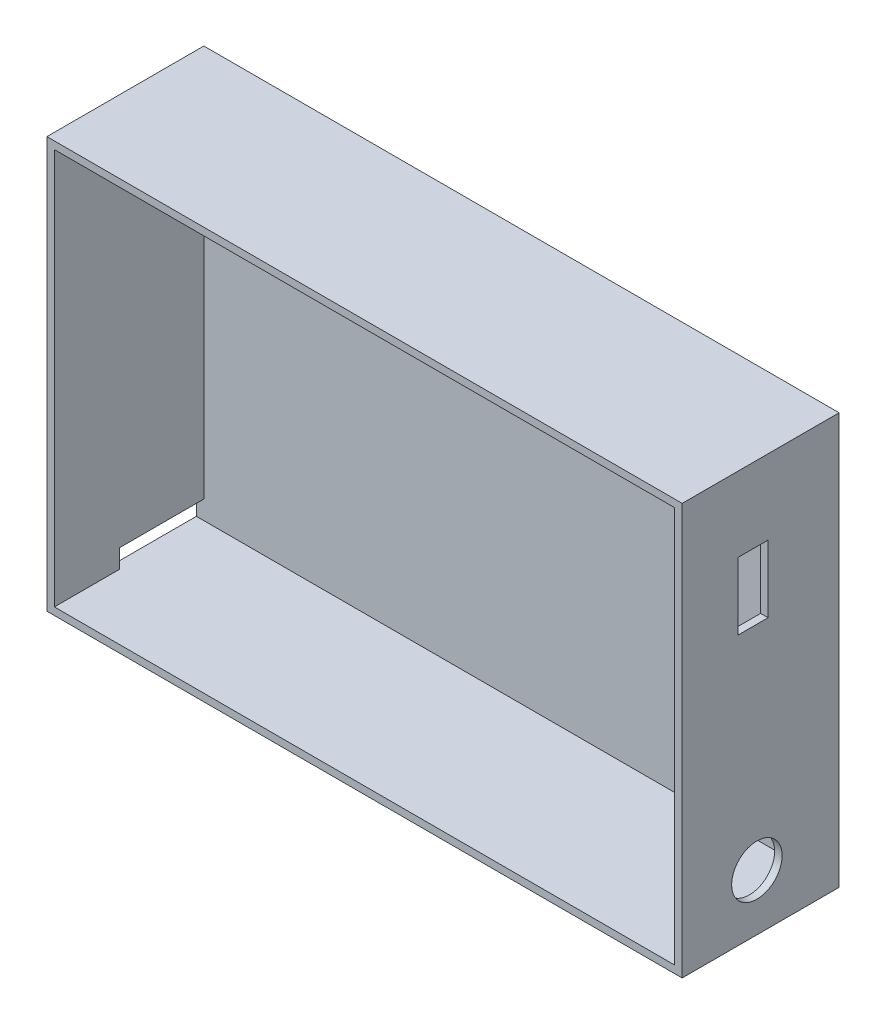
ISO-10303-21;
HEADER;
FILE_DESCRIPTION(('STEP AP214'),'2;1');
FILE_NAME('part.step','',(''),(''),'','','');
FILE_SCHEMA(('AUTOMOTIVE_DESIGN { 1 0 10303 214 1 1 1 1 }'));
ENDSEC;
DATA;
#1=APPLICATION_CONTEXT('core data for automotive mechanical design processes');
#2=APPLICATION_PROTOCOL_DEFINITION('international standard','automotive_design',2000,#1);
#3=PRODUCT_CONTEXT('',#1,'mechanical');
#4=PRODUCT('Part','Part','',(#3));
#5=PRODUCT_RELATED_PRODUCT_CATEGORY('part','',(#4));
#6=PRODUCT_DEFINITION_FORMATION('','',#4);
#7=PRODUCT_DEFINITION_CONTEXT('part definition',#1,'design');
#8=PRODUCT_DEFINITION('design','',#6,#7);
#9=PRODUCT_DEFINITION_SHAPE('','',#8);
#10=(LENGTH_UNIT() NAMED_UNIT(*) SI_UNIT(.MILLI.,.METRE.));
#11=(NAMED_UNIT(*) PLANE_ANGLE_UNIT() SI_UNIT($,.RADIAN.));
#12=(NAMED_UNIT(*) SI_UNIT($,.STERADIAN.) SOLID_ANGLE_UNIT());
#13=UNCERTAINTY_MEASURE_WITH_UNIT(LENGTH_MEASURE(1.E-05),#10,'distance_accuracy_value','');
#14=(GEOMETRIC_REPRESENTATION_CONTEXT(3) GLOBAL_UNCERTAINTY_ASSIGNED_CONTEXT((#13)) GLOBAL_UNIT_ASSIGNED_CONTEXT((#10,
#11,#12)) REPRESENTATION_CONTEXT('',''));
#15=CARTESIAN_POINT('',(0.,0.,0.));
#16=DIRECTION('',(0.,0.,1.));
#17=DIRECTION('',(1.,0.,0.));
#18=AXIS2_PLACEMENT_3D('',#15,#16,#17);
#19=CARTESIAN_POINT('',(85.,55.,2.));
#20=DIRECTION('',(-1.,0.,0.));
#21=DIRECTION('',(0.,-1.,0.));
#22=AXIS2_PLACEMENT_3D('',#19,#20,#21);
#23=PLANE('',#22);
#24=DIRECTION('',(0.,0.,1.));
#25=VECTOR('',#24,1.);
#26=CARTESIAN_POINT('',(85.,35.,27.));
#27=LINE('',#26,#25);
#28=CARTESIAN_POINT('',(85.,35.,19.));
#29=VERTEX_POINT('',#28);
#30=CARTESIAN_POINT('',(85.,35.,27.));
#31=VERTEX_POINT('',#30);
#32=EDGE_CURVE('E310',#29,#31,#27,.T.);
#33=ORIENTED_EDGE('',*,*,#32,.F.);
#34=DIRECTION('',(0.,1.,0.));
#35=VECTOR('',#34,1.);
#36=CARTESIAN_POINT('',(85.,35.,19.));
#37=LINE('',#36,#35);
#38=CARTESIAN_POINT('',(85.,17.,19.));
#39=VERTEX_POINT('',#38);
#40=EDGE_CURVE('E58',#39,#29,#37,.T.);
#41=ORIENTED_EDGE('',*,*,#40,.F.);
#42=DIRECTION('',(0.,0.,-1.));
#43=VECTOR('',#42,1.);
#44=CARTESIAN_POINT('',(85.,17.,27.));
#45=LINE('',#44,#43);
#46=CARTESIAN_POINT('',(85.,17.,27.));
#47=VERTEX_POINT('',#46);
#48=EDGE_CURVE('E299',#47,#39,#45,.T.);
#49=ORIENTED_EDGE('',*,*,#48,.F.);
#50=DIRECTION('',(0.,-1.,0.));
#51=VECTOR('',#50,1.);
#52=CARTESIAN_POINT('',(85.,35.,27.));
#53=LINE('',#52,#51);
#54=EDGE_CURVE('E314',#31,#47,#53,.T.);
#55=ORIENTED_EDGE('',*,*,#54,.F.);
#56=EDGE_LOOP('',(#33,#41,#49,#55));
#57=FACE_BOUND('',#56,.T.);
#58=CARTESIAN_POINT('',(85.,-39.9912273951,22.));
#59=DIRECTION('',(1.,0.,0.));
#60=DIRECTION('',(0.,1.,0.));
#61=AXIS2_PLACEMENT_3D('',#58,#59,#60);
#62=CIRCLE('',#61,6.75);
#63=CARTESIAN_POINT('',(85.,-33.2412273951,22.));
#64=VERTEX_POINT('',#63);
#65=EDGE_CURVE('E311',#64,#64,#62,.T.);
#66=ORIENTED_EDGE('',*,*,#65,.F.);
#67=EDGE_LOOP('',(#66));
#68=FACE_BOUND('',#67,.T.);
#69=DIRECTION('',(0.,1.,0.));
#70=VECTOR('',#69,1.);
#71=CARTESIAN_POINT('',(85.,55.,0.));
#72=LINE('',#71,#70);
#73=CARTESIAN_POINT('',(85.,-55.,0.));
#74=VERTEX_POINT('',#73);
#75=CARTESIAN_POINT('',(85.,55.,0.));
#76=VERTEX_POINT('',#75);
#77=EDGE_CURVE('E189',#74,#76,#72,.T.);
#78=ORIENTED_EDGE('',*,*,#77,.T.);
#79=DIRECTION('',(0.,0.,-1.));
#80=VECTOR('',#79,1.);
#81=CARTESIAN_POINT('',(85.,55.,2.));
#82=LINE('',#81,#80);
#83=CARTESIAN_POINT('',(85.,55.,42.));
#84=VERTEX_POINT('',#83);
#85=EDGE_CURVE('E11',#84,#76,#82,.T.);
#86=ORIENTED_EDGE('',*,*,#85,.F.);
#87=DIRECTION('',(0.,1.,0.));
#88=VECTOR('',#87,1.);
#89=CARTESIAN_POINT('',(85.,55.,42.));
#90=LINE('',#89,#88);
#91=CARTESIAN_POINT('',(85.,-55.,42.));
#92=VERTEX_POINT('',#91);
#93=EDGE_CURVE('E183',#92,#84,#90,.T.);
#94=ORIENTED_EDGE('',*,*,#93,.F.);
#95=DIRECTION('',(0.,0.,-1.));
#96=VECTOR('',#95,1.);
#97=CARTESIAN_POINT('',(85.,-55.,2.));
#98=LINE('',#97,#96);
#99=EDGE_CURVE('E198',#92,#74,#98,.T.);
#100=ORIENTED_EDGE('',*,*,#99,.T.);
#101=EDGE_LOOP('',(#78,#86,#94,#100));
#102=FACE_BOUND('',#101,.T.);
#103=ADVANCED_FACE('F36',(#57,#68,#102),#23,.F.);
#104=CARTESIAN_POINT('',(-85.,55.,2.));
#105=DIRECTION('',(0.,-1.,0.));
#106=DIRECTION('',(0.,0.,-1.));
#107=AXIS2_PLACEMENT_3D('',#104,#105,#106);
#108=PLANE('',#107);
#109=DIRECTION('',(-1.,0.,0.));
#110=VECTOR('',#109,1.);
#111=CARTESIAN_POINT('',(-85.,55.,0.));
#112=LINE('',#111,#110);
#113=CARTESIAN_POINT('',(-85.,55.,0.));
#114=VERTEX_POINT('',#113);
#115=EDGE_CURVE('E192',#76,#114,#112,.T.);
#116=ORIENTED_EDGE('',*,*,#115,.T.);
#117=DIRECTION('',(0.,0.,-1.));
#118=VECTOR('',#117,1.);
#119=CARTESIAN_POINT('',(-85.,55.,2.));
#120=LINE('',#119,#118);
#121=CARTESIAN_POINT('',(-85.,55.,42.));
#122=VERTEX_POINT('',#121);
#123=EDGE_CURVE('E43',#122,#114,#120,.T.);
#124=ORIENTED_EDGE('',*,*,#123,.F.);
#125=DIRECTION('',(-1.,0.,0.));
#126=VECTOR('',#125,1.);
#127=CARTESIAN_POINT('',(-85.,55.,42.));
#128=LINE('',#127,#126);
#129=EDGE_CURVE('E186',#84,#122,#128,.T.);
#130=ORIENTED_EDGE('',*,*,#129,.F.);
#131=ORIENTED_EDGE('',*,*,#85,.T.);
#132=EDGE_LOOP('',(#116,#124,#130,#131));
#133=FACE_BOUND('',#132,.T.);
#134=ADVANCED_FACE('F222',(#133),#108,.F.);
#135=CARTESIAN_POINT('',(-85.,55.,2.));
#136=DIRECTION('',(1.,0.,0.));
#137=DIRECTION('',(0.,1.,0.));
#138=AXIS2_PLACEMENT_3D('',#135,#136,#137);
#139=PLANE('',#138);
#140=DIRECTION('',(0.,0.,1.));
#141=VECTOR('',#140,1.);
#142=CARTESIAN_POINT('',(-85.,-53.,2.));
#143=LINE('',#142,#141);
#144=CARTESIAN_POINT('',(-85.,-53.,2.));
#145=VERTEX_POINT('',#144);
#146=CARTESIAN_POINT('',(-85.,-53.,24.6080789141284));
#147=VERTEX_POINT('',#146);
#148=EDGE_CURVE('E149',#145,#147,#143,.T.);
#149=ORIENTED_EDGE('',*,*,#148,.F.);
#150=DIRECTION('',(0.,-1.,0.));
#151=VECTOR('',#150,1.);
#152=CARTESIAN_POINT('',(-85.,-48.,2.00000000000002));
#153=LINE('',#152,#151);
#154=CARTESIAN_POINT('',(-85.,-48.,2.00000000000002));
#155=VERTEX_POINT('',#154);
#156=EDGE_CURVE('E286',#155,#145,#153,.T.);
#157=ORIENTED_EDGE('',*,*,#156,.F.);
#158=DIRECTION('',(0.,0.,-1.));
#159=VECTOR('',#158,1.);
#160=CARTESIAN_POINT('',(-85.,-48.,2.00000000000002));
#161=LINE('',#160,#159);
#162=CARTESIAN_POINT('',(-85.,-48.,24.6080789141284));
#163=VERTEX_POINT('',#162);
#164=EDGE_CURVE('E162',#163,#155,#161,.T.);
#165=ORIENTED_EDGE('',*,*,#164,.F.);
#166=DIRECTION('',(0.,1.,0.));
#167=VECTOR('',#166,1.);
#168=CARTESIAN_POINT('',(-85.,-48.,24.6080789141284));
#169=LINE('',#168,#167);
#170=EDGE_CURVE('E284',#147,#163,#169,.T.);
#171=ORIENTED_EDGE('',*,*,#170,.F.);
#172=EDGE_LOOP('',(#149,#157,#165,#171));
#173=FACE_BOUND('',#172,.T.);
#174=DIRECTION('',(0.,-1.,0.));
#175=VECTOR('',#174,1.);
#176=CARTESIAN_POINT('',(-85.,55.,0.));
#177=LINE('',#176,#175);
#178=CARTESIAN_POINT('',(-85.,-55.,0.));
#179=VERTEX_POINT('',#178);
#180=EDGE_CURVE('E194',#114,#179,#177,.T.);
#181=ORIENTED_EDGE('',*,*,#180,.T.);
#182=DIRECTION('',(0.,0.,-1.));
#183=VECTOR('',#182,1.);
#184=CARTESIAN_POINT('',(-85.,-55.,2.));
#185=LINE('',#184,#183);
#186=CARTESIAN_POINT('',(-85.,-55.,42.));
#187=VERTEX_POINT('',#186);
#188=EDGE_CURVE('E201',#187,#179,#185,.T.);
#189=ORIENTED_EDGE('',*,*,#188,.F.);
#190=DIRECTION('',(0.,-1.,0.));
#191=VECTOR('',#190,1.);
#192=CARTESIAN_POINT('',(-85.,55.,42.));
#193=LINE('',#192,#191);
#194=EDGE_CURVE('E172',#122,#187,#193,.T.);
#195=ORIENTED_EDGE('',*,*,#194,.F.);
#196=ORIENTED_EDGE('',*,*,#123,.T.);
#197=EDGE_LOOP('',(#181,#189,#195,#196));
#198=FACE_BOUND('',#197,.T.);
#199=ADVANCED_FACE('F207',(#173,#198),#139,.F.);
#200=CARTESIAN_POINT('',(-85.,-55.,2.));
#201=DIRECTION('',(0.,1.,0.));
#202=DIRECTION('',(0.,0.,1.));
#203=AXIS2_PLACEMENT_3D('',#200,#201,#202);
#204=PLANE('',#203);
#205=DIRECTION('',(1.,0.,0.));
#206=VECTOR('',#205,1.);
#207=CARTESIAN_POINT('',(-85.,-55.,0.));
#208=LINE('',#207,#206);
#209=EDGE_CURVE('E196',#179,#74,#208,.T.);
#210=ORIENTED_EDGE('',*,*,#209,.T.);
#211=ORIENTED_EDGE('',*,*,#99,.F.);
#212=DIRECTION('',(1.,0.,0.));
#213=VECTOR('',#212,1.);
#214=CARTESIAN_POINT('',(-85.,-55.,42.));
#215=LINE('',#214,#213);
#216=EDGE_CURVE('E180',#187,#92,#215,.T.);
#217=ORIENTED_EDGE('',*,*,#216,.F.);
#218=ORIENTED_EDGE('',*,*,#188,.T.);
#219=EDGE_LOOP('',(#210,#211,#217,#218));
#220=FACE_BOUND('',#219,.T.);
#221=ADVANCED_FACE('F215',(#220),#204,.F.);
#222=CARTESIAN_POINT('',(0.,0.,0.));
#223=DIRECTION('',(0.,0.,1.));
#224=DIRECTION('',(1.,0.,0.));
#225=AXIS2_PLACEMENT_3D('',#222,#223,#224);
#226=PLANE('',#225);
#227=ORIENTED_EDGE('',*,*,#77,.F.);
#228=ORIENTED_EDGE('',*,*,#209,.F.);
#229=ORIENTED_EDGE('',*,*,#180,.F.);
#230=ORIENTED_EDGE('',*,*,#115,.F.);
#231=EDGE_LOOP('',(#227,#228,#229,#230));
#232=FACE_BOUND('',#231,.T.);
#233=ADVANCED_FACE('F213',(#232),#226,.F.);
#234=CARTESIAN_POINT('',(0.,0.,42.));
#235=DIRECTION('',(0.,0.,1.));
#236=DIRECTION('',(1.,0.,0.));
#237=AXIS2_PLACEMENT_3D('',#234,#235,#236);
#238=PLANE('',#237);
#239=ORIENTED_EDGE('',*,*,#194,.T.);
#240=ORIENTED_EDGE('',*,*,#216,.T.);
#241=ORIENTED_EDGE('',*,*,#93,.T.);
#242=ORIENTED_EDGE('',*,*,#129,.T.);
#243=EDGE_LOOP('',(#239,#240,#241,#242));
#244=FACE_BOUND('',#243,.T.);
#245=DIRECTION('',(0.,-1.,0.));
#246=VECTOR('',#245,1.);
#247=CARTESIAN_POINT('',(-83.,53.,42.));
#248=LINE('',#247,#246);
#249=CARTESIAN_POINT('',(-83.,53.,42.));
#250=VERTEX_POINT('',#249);
#251=CARTESIAN_POINT('',(-83.,-53.,42.));
#252=VERTEX_POINT('',#251);
#253=EDGE_CURVE('E167',#250,#252,#248,.T.);
#254=ORIENTED_EDGE('',*,*,#253,.F.);
#255=DIRECTION('',(-1.,0.,0.));
#256=VECTOR('',#255,1.);
#257=CARTESIAN_POINT('',(-83.,53.,42.));
#258=LINE('',#257,#256);
#259=CARTESIAN_POINT('',(83.,53.,42.));
#260=VERTEX_POINT('',#259);
#261=EDGE_CURVE('E331',#260,#250,#258,.T.);
#262=ORIENTED_EDGE('',*,*,#261,.F.);
#263=DIRECTION('',(0.,1.,0.));
#264=VECTOR('',#263,1.);
#265=CARTESIAN_POINT('',(83.,53.,42.));
#266=LINE('',#265,#264);
#267=CARTESIAN_POINT('',(83.,-53.,42.));
#268=VERTEX_POINT('',#267);
#269=EDGE_CURVE('E337',#268,#260,#266,.T.);
#270=ORIENTED_EDGE('',*,*,#269,.F.);
#271=DIRECTION('',(1.,0.,0.));
#272=VECTOR('',#271,1.);
#273=CARTESIAN_POINT('',(-83.,-53.,42.));
#274=LINE('',#273,#272);
#275=EDGE_CURVE('E335',#252,#268,#274,.T.);
#276=ORIENTED_EDGE('',*,*,#275,.F.);
#277=EDGE_LOOP('',(#254,#262,#270,#276));
#278=FACE_BOUND('',#277,.T.);
#279=ADVANCED_FACE('F220',(#244,#278),#238,.T.);
#280=CARTESIAN_POINT('',(-83.,53.,42.));
#281=DIRECTION('',(0.,-1.,0.));
#282=DIRECTION('',(0.,0.,-1.));
#283=AXIS2_PLACEMENT_3D('',#280,#281,#282);
#284=PLANE('',#283);
#285=DIRECTION('',(-1.,0.,0.));
#286=VECTOR('',#285,1.);
#287=CARTESIAN_POINT('',(-83.,53.,2.));
#288=LINE('',#287,#286);
#289=CARTESIAN_POINT('',(83.,53.,2.));
#290=VERTEX_POINT('',#289);
#291=CARTESIAN_POINT('',(-83.,53.,2.));
#292=VERTEX_POINT('',#291);
#293=EDGE_CURVE('E321',#290,#292,#288,.T.);
#294=ORIENTED_EDGE('',*,*,#293,.F.);
#295=DIRECTION('',(0.,0.,-1.));
#296=VECTOR('',#295,1.);
#297=CARTESIAN_POINT('',(83.,53.,42.));
#298=LINE('',#297,#296);
#299=EDGE_CURVE('E174',#260,#290,#298,.T.);
#300=ORIENTED_EDGE('',*,*,#299,.F.);
#301=ORIENTED_EDGE('',*,*,#261,.T.);
#302=DIRECTION('',(0.,0.,-1.));
#303=VECTOR('',#302,1.);
#304=CARTESIAN_POINT('',(-83.,53.,42.));
#305=LINE('',#304,#303);
#306=EDGE_CURVE('E168',#250,#292,#305,.T.);
#307=ORIENTED_EDGE('',*,*,#306,.T.);
#308=EDGE_LOOP('',(#294,#300,#301,#307));
#309=FACE_BOUND('',#308,.T.);
#310=ADVANCED_FACE('F244',(#309),#284,.T.);
#311=CARTESIAN_POINT('',(-83.,53.,42.));
#312=DIRECTION('',(1.,0.,0.));
#313=DIRECTION('',(0.,0.,-1.));
#314=AXIS2_PLACEMENT_3D('',#311,#312,#313);
#315=PLANE('',#314);
#316=DIRECTION('',(0.,0.,-1.));
#317=VECTOR('',#316,1.);
#318=CARTESIAN_POINT('',(-83.,-48.,2.00000000000002));
#319=LINE('',#318,#317);
#320=CARTESIAN_POINT('',(-83.,-48.,24.6080789141284));
#321=VERTEX_POINT('',#320);
#322=CARTESIAN_POINT('',(-83.,-48.,2.00000000000002));
#323=VERTEX_POINT('',#322);
#324=EDGE_CURVE('E154',#321,#323,#319,.T.);
#325=ORIENTED_EDGE('',*,*,#324,.T.);
#326=DIRECTION('',(0.,-1.,0.));
#327=VECTOR('',#326,1.);
#328=CARTESIAN_POINT('',(-83.,53.,2.));
#329=LINE('',#328,#327);
#330=EDGE_CURVE('E340',#292,#323,#329,.T.);
#331=ORIENTED_EDGE('',*,*,#330,.F.);
#332=ORIENTED_EDGE('',*,*,#306,.F.);
#333=ORIENTED_EDGE('',*,*,#253,.T.);
#334=DIRECTION('',(0.,0.,-1.));
#335=VECTOR('',#334,1.);
#336=CARTESIAN_POINT('',(-83.,-53.,42.));
#337=LINE('',#336,#335);
#338=CARTESIAN_POINT('',(-83.,-53.,24.6080789141284));
#339=VERTEX_POINT('',#338);
#340=EDGE_CURVE('E146',#252,#339,#337,.T.);
#341=ORIENTED_EDGE('',*,*,#340,.T.);
#342=DIRECTION('',(0.,1.,0.));
#343=VECTOR('',#342,1.);
#344=CARTESIAN_POINT('',(-83.,-48.,24.6080789141284));
#345=LINE('',#344,#343);
#346=EDGE_CURVE('E157',#339,#321,#345,.T.);
#347=ORIENTED_EDGE('',*,*,#346,.T.);
#348=EDGE_LOOP('',(#325,#331,#332,#333,#341,#347));
#349=FACE_BOUND('',#348,.T.);
#350=ADVANCED_FACE('F164',(#349),#315,.T.);
#351=CARTESIAN_POINT('',(-83.,-53.,42.));
#352=DIRECTION('',(0.,1.,0.));
#353=DIRECTION('',(0.,0.,1.));
#354=AXIS2_PLACEMENT_3D('',#351,#352,#353);
#355=PLANE('',#354);
#356=DIRECTION('',(1.,0.,0.));
#357=VECTOR('',#356,1.);
#358=CARTESIAN_POINT('',(-83.,-53.,2.));
#359=LINE('',#358,#357);
#360=CARTESIAN_POINT('',(83.,-53.,2.));
#361=VERTEX_POINT('',#360);
#362=EDGE_CURVE('E50',#145,#361,#359,.T.);
#363=ORIENTED_EDGE('',*,*,#362,.F.);
#364=ORIENTED_EDGE('',*,*,#148,.T.);
#365=DIRECTION('',(-1.,0.,0.));
#366=VECTOR('',#365,1.);
#367=CARTESIAN_POINT('',(-83.,-53.,24.6080789141284));
#368=LINE('',#367,#366);
#369=EDGE_CURVE('E141',#339,#147,#368,.T.);
#370=ORIENTED_EDGE('',*,*,#369,.F.);
#371=ORIENTED_EDGE('',*,*,#340,.F.);
#372=ORIENTED_EDGE('',*,*,#275,.T.);
#373=DIRECTION('',(0.,0.,-1.));
#374=VECTOR('',#373,1.);
#375=CARTESIAN_POINT('',(83.,-53.,42.));
#376=LINE('',#375,#374);
#377=EDGE_CURVE('E169',#268,#361,#376,.T.);
#378=ORIENTED_EDGE('',*,*,#377,.T.);
#379=EDGE_LOOP('',(#363,#364,#370,#371,#372,#378));
#380=FACE_BOUND('',#379,.T.);
#381=ADVANCED_FACE('F143',(#380),#355,.T.);
#382=CARTESIAN_POINT('',(83.,53.,42.));
#383=DIRECTION('',(-1.,0.,0.));
#384=DIRECTION('',(0.,0.,1.));
#385=AXIS2_PLACEMENT_3D('',#382,#383,#384);
#386=PLANE('',#385);
#387=DIRECTION('',(0.,1.,0.));
#388=VECTOR('',#387,1.);
#389=CARTESIAN_POINT('',(83.,35.,19.));
#390=LINE('',#389,#388);
#391=CARTESIAN_POINT('',(83.,17.,19.));
#392=VERTEX_POINT('',#391);
#393=CARTESIAN_POINT('',(83.,35.,19.));
#394=VERTEX_POINT('',#393);
#395=EDGE_CURVE('E295',#392,#394,#390,.T.);
#396=ORIENTED_EDGE('',*,*,#395,.T.);
#397=DIRECTION('',(0.,0.,1.));
#398=VECTOR('',#397,1.);
#399=CARTESIAN_POINT('',(83.,35.,27.));
#400=LINE('',#399,#398);
#401=CARTESIAN_POINT('',(83.,35.,27.));
#402=VERTEX_POINT('',#401);
#403=EDGE_CURVE('E298',#394,#402,#400,.T.);
#404=ORIENTED_EDGE('',*,*,#403,.T.);
#405=DIRECTION('',(0.,-1.,0.));
#406=VECTOR('',#405,1.);
#407=CARTESIAN_POINT('',(83.,35.,27.));
#408=LINE('',#407,#406);
#409=CARTESIAN_POINT('',(83.,17.,27.));
#410=VERTEX_POINT('',#409);
#411=EDGE_CURVE('E302',#402,#410,#408,.T.);
#412=ORIENTED_EDGE('',*,*,#411,.T.);
#413=DIRECTION('',(0.,0.,-1.));
#414=VECTOR('',#413,1.);
#415=CARTESIAN_POINT('',(83.,17.,27.));
#416=LINE('',#415,#414);
#417=EDGE_CURVE('E305',#410,#392,#416,.T.);
#418=ORIENTED_EDGE('',*,*,#417,.T.);
#419=EDGE_LOOP('',(#396,#404,#412,#418));
#420=FACE_BOUND('',#419,.T.);
#421=CARTESIAN_POINT('',(83.,-39.9912273951,22.));
#422=DIRECTION('',(1.,0.,0.));
#423=DIRECTION('',(0.,1.,0.));
#424=AXIS2_PLACEMENT_3D('',#421,#422,#423);
#425=CIRCLE('',#424,6.75);
#426=CARTESIAN_POINT('',(83.,-33.2412273951,22.));
#427=VERTEX_POINT('',#426);
#428=EDGE_CURVE('E293',#427,#427,#425,.T.);
#429=ORIENTED_EDGE('',*,*,#428,.T.);
#430=EDGE_LOOP('',(#429));
#431=FACE_BOUND('',#430,.T.);
#432=DIRECTION('',(0.,1.,0.));
#433=VECTOR('',#432,1.);
#434=CARTESIAN_POINT('',(83.,53.,2.));
#435=LINE('',#434,#433);
#436=EDGE_CURVE('E333',#361,#290,#435,.T.);
#437=ORIENTED_EDGE('',*,*,#436,.F.);
#438=ORIENTED_EDGE('',*,*,#377,.F.);
#439=ORIENTED_EDGE('',*,*,#269,.T.);
#440=ORIENTED_EDGE('',*,*,#299,.T.);
#441=EDGE_LOOP('',(#437,#438,#439,#440));
#442=FACE_BOUND('',#441,.T.);
#443=ADVANCED_FACE('F240',(#420,#431,#442),#386,.T.);
#444=CARTESIAN_POINT('',(0.,0.,2.));
#445=DIRECTION('',(0.,0.,1.));
#446=DIRECTION('',(1.,0.,0.));
#447=AXIS2_PLACEMENT_3D('',#444,#445,#446);
#448=PLANE('',#447);
#449=ORIENTED_EDGE('',*,*,#293,.T.);
#450=ORIENTED_EDGE('',*,*,#330,.T.);
#451=DIRECTION('',(-1.,0.,0.));
#452=VECTOR('',#451,1.);
#453=CARTESIAN_POINT('',(-83.,-48.,2.00000000000002));
#454=LINE('',#453,#452);
#455=EDGE_CURVE('E283',#323,#155,#454,.T.);
#456=ORIENTED_EDGE('',*,*,#455,.T.);
#457=ORIENTED_EDGE('',*,*,#156,.T.);
#458=ORIENTED_EDGE('',*,*,#362,.T.);
#459=ORIENTED_EDGE('',*,*,#436,.T.);
#460=EDGE_LOOP('',(#449,#450,#456,#457,#458,#459));
#461=FACE_BOUND('',#460,.T.);
#462=ADVANCED_FACE('F236',(#461),#448,.T.);
#463=CARTESIAN_POINT('',(83.,-39.9912273951,22.));
#464=DIRECTION('',(1.,0.,0.));
#465=DIRECTION('',(0.,1.,0.));
#466=AXIS2_PLACEMENT_3D('',#463,#464,#465);
#467=CYLINDRICAL_SURFACE('',#466,6.75);
#468=ORIENTED_EDGE('',*,*,#428,.F.);
#469=EDGE_LOOP('',(#468));
#470=FACE_BOUND('',#469,.T.);
#471=ORIENTED_EDGE('',*,*,#65,.T.);
#472=EDGE_LOOP('',(#471));
#473=FACE_BOUND('',#472,.T.);
#474=ADVANCED_FACE('F239',(#470,#473),#467,.F.);
#475=CARTESIAN_POINT('',(83.,35.,19.));
#476=DIRECTION('',(0.,0.,-1.));
#477=DIRECTION('',(0.,1.,0.));
#478=AXIS2_PLACEMENT_3D('',#475,#476,#477);
#479=PLANE('',#478);
#480=ORIENTED_EDGE('',*,*,#40,.T.);
#481=DIRECTION('',(1.,0.,0.));
#482=VECTOR('',#481,1.);
#483=CARTESIAN_POINT('',(83.,35.,19.));
#484=LINE('',#483,#482);
#485=EDGE_CURVE('E308',#394,#29,#484,.T.);
#486=ORIENTED_EDGE('',*,*,#485,.F.);
#487=ORIENTED_EDGE('',*,*,#395,.F.);
#488=DIRECTION('',(1.,0.,0.));
#489=VECTOR('',#488,1.);
#490=CARTESIAN_POINT('',(83.,17.,19.));
#491=LINE('',#490,#489);
#492=EDGE_CURVE('E319',#392,#39,#491,.T.);
#493=ORIENTED_EDGE('',*,*,#492,.T.);
#494=EDGE_LOOP('',(#480,#486,#487,#493));
#495=FACE_BOUND('',#494,.T.);
#496=ADVANCED_FACE('F257',(#495),#479,.F.);
#497=CARTESIAN_POINT('',(83.,17.,27.));
#498=DIRECTION('',(0.,-1.,0.));
#499=DIRECTION('',(1.,0.,0.));
#500=AXIS2_PLACEMENT_3D('',#497,#498,#499);
#501=PLANE('',#500);
#502=ORIENTED_EDGE('',*,*,#48,.T.);
#503=ORIENTED_EDGE('',*,*,#492,.F.);
#504=ORIENTED_EDGE('',*,*,#417,.F.);
#505=DIRECTION('',(1.,0.,0.));
#506=VECTOR('',#505,1.);
#507=CARTESIAN_POINT('',(83.,17.,27.));
#508=LINE('',#507,#506);
#509=EDGE_CURVE('E322',#410,#47,#508,.T.);
#510=ORIENTED_EDGE('',*,*,#509,.T.);
#511=EDGE_LOOP('',(#502,#503,#504,#510));
#512=FACE_BOUND('',#511,.T.);
#513=ADVANCED_FACE('F261',(#512),#501,.F.);
#514=CARTESIAN_POINT('',(83.,35.,27.));
#515=DIRECTION('',(0.,0.,1.));
#516=DIRECTION('',(0.,-1.,0.));
#517=AXIS2_PLACEMENT_3D('',#514,#515,#516);
#518=PLANE('',#517);
#519=ORIENTED_EDGE('',*,*,#54,.T.);
#520=ORIENTED_EDGE('',*,*,#509,.F.);
#521=ORIENTED_EDGE('',*,*,#411,.F.);
#522=DIRECTION('',(1.,0.,0.));
#523=VECTOR('',#522,1.);
#524=CARTESIAN_POINT('',(83.,35.,27.));
#525=LINE('',#524,#523);
#526=EDGE_CURVE('E324',#402,#31,#525,.T.);
#527=ORIENTED_EDGE('',*,*,#526,.T.);
#528=EDGE_LOOP('',(#519,#520,#521,#527));
#529=FACE_BOUND('',#528,.T.);
#530=ADVANCED_FACE('F266',(#529),#518,.F.);
#531=CARTESIAN_POINT('',(83.,35.,27.));
#532=DIRECTION('',(0.,1.,0.));
#533=DIRECTION('',(0.,0.,1.));
#534=AXIS2_PLACEMENT_3D('',#531,#532,#533);
#535=PLANE('',#534);
#536=ORIENTED_EDGE('',*,*,#32,.T.);
#537=ORIENTED_EDGE('',*,*,#526,.F.);
#538=ORIENTED_EDGE('',*,*,#403,.F.);
#539=ORIENTED_EDGE('',*,*,#485,.T.);
#540=EDGE_LOOP('',(#536,#537,#538,#539));
#541=FACE_BOUND('',#540,.T.);
#542=ADVANCED_FACE('F262',(#541),#535,.F.);
#543=CARTESIAN_POINT('',(-83.,-48.,2.00000000000002));
#544=DIRECTION('',(0.,1.,0.));
#545=DIRECTION('',(0.,0.,1.));
#546=AXIS2_PLACEMENT_3D('',#543,#544,#545);
#547=PLANE('',#546);
#548=ORIENTED_EDGE('',*,*,#164,.T.);
#549=ORIENTED_EDGE('',*,*,#455,.F.);
#550=ORIENTED_EDGE('',*,*,#324,.F.);
#551=DIRECTION('',(-1.,0.,0.));
#552=VECTOR('',#551,1.);
#553=CARTESIAN_POINT('',(-83.,-48.,24.6080789141284));
#554=LINE('',#553,#552);
#555=EDGE_CURVE('E153',#321,#163,#554,.T.);
#556=ORIENTED_EDGE('',*,*,#555,.T.);
#557=EDGE_LOOP('',(#548,#549,#550,#556));
#558=FACE_BOUND('',#557,.T.);
#559=ADVANCED_FACE('F265',(#558),#547,.F.);
#560=CARTESIAN_POINT('',(-83.,-48.,24.6080789141284));
#561=DIRECTION('',(0.,0.,1.));
#562=DIRECTION('',(0.,-1.,0.));
#563=AXIS2_PLACEMENT_3D('',#560,#561,#562);
#564=PLANE('',#563);
#565=ORIENTED_EDGE('',*,*,#170,.T.);
#566=ORIENTED_EDGE('',*,*,#555,.F.);
#567=ORIENTED_EDGE('',*,*,#346,.F.);
#568=ORIENTED_EDGE('',*,*,#369,.T.);
#569=EDGE_LOOP('',(#565,#566,#567,#568));
#570=FACE_BOUND('',#569,.T.);
#571=ADVANCED_FACE('F158',(#570),#564,.F.);
#572=CLOSED_SHELL('',(#103,#134,#199,#221,#233,#279,#310,#350,#381,#443,#462,#474,#496,#513,
#530,#542,#559,#571));
#573=MANIFOLD_SOLID_BREP('B2',#572);
#574=ADVANCED_BREP_SHAPE_REPRESENTATION('',(#18,#573),#14);
#575=SHAPE_DEFINITION_REPRESENTATION(#9,#574);
ENDSEC;
END-ISO-10303-21;
